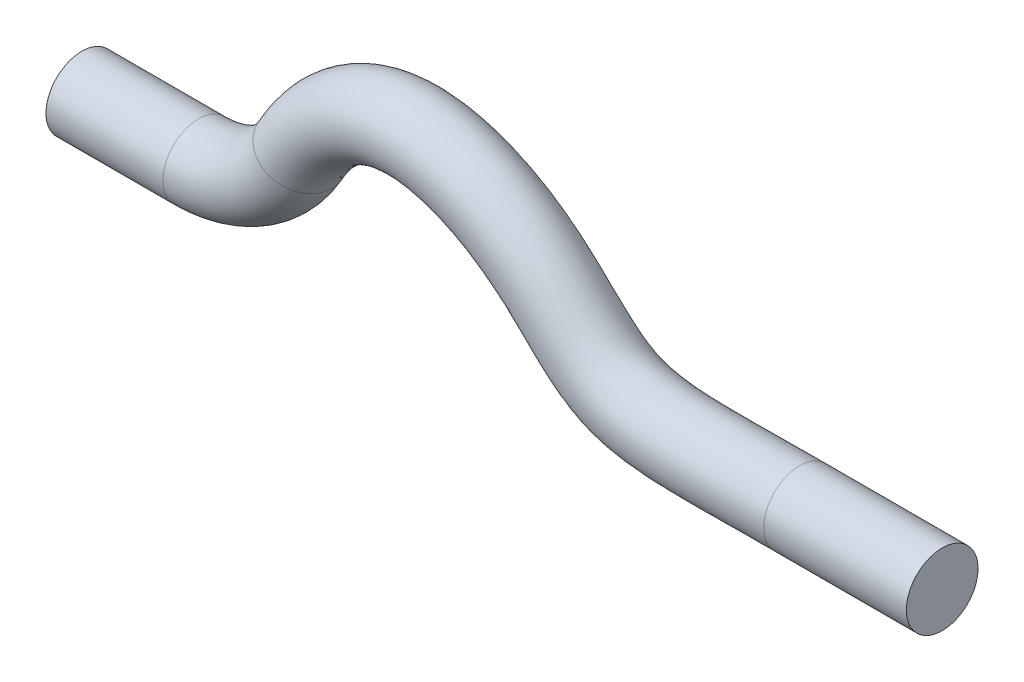
ISO-10303-21;
HEADER;
FILE_DESCRIPTION(('STEP AP214'),'2;1');
FILE_NAME('part.step','',(''),(''),'','','');
FILE_SCHEMA(('AUTOMOTIVE_DESIGN { 1 0 10303 214 1 1 1 1 }'));
ENDSEC;
DATA;
#1=APPLICATION_CONTEXT('core data for automotive mechanical design processes');
#2=APPLICATION_PROTOCOL_DEFINITION('international standard','automotive_design',2000,#1);
#3=PRODUCT_CONTEXT('',#1,'mechanical');
#4=PRODUCT('Part','Part','',(#3));
#5=PRODUCT_RELATED_PRODUCT_CATEGORY('part','',(#4));
#6=PRODUCT_DEFINITION_FORMATION('','',#4);
#7=PRODUCT_DEFINITION_CONTEXT('part definition',#1,'design');
#8=PRODUCT_DEFINITION('design','',#6,#7);
#9=PRODUCT_DEFINITION_SHAPE('','',#8);
#10=(LENGTH_UNIT() NAMED_UNIT(*) SI_UNIT(.MILLI.,.METRE.));
#11=(NAMED_UNIT(*) PLANE_ANGLE_UNIT() SI_UNIT($,.RADIAN.));
#12=(NAMED_UNIT(*) SI_UNIT($,.STERADIAN.) SOLID_ANGLE_UNIT());
#13=UNCERTAINTY_MEASURE_WITH_UNIT(LENGTH_MEASURE(1.E-05),#10,'distance_accuracy_value','');
#14=(GEOMETRIC_REPRESENTATION_CONTEXT(3) GLOBAL_UNCERTAINTY_ASSIGNED_CONTEXT((#13)) GLOBAL_UNIT_ASSIGNED_CONTEXT((#10,
#11,#12)) REPRESENTATION_CONTEXT('',''));
#15=CARTESIAN_POINT('',(0.,0.,0.));
#16=DIRECTION('',(0.,0.,1.));
#17=DIRECTION('',(1.,0.,0.));
#18=AXIS2_PLACEMENT_3D('',#15,#16,#17);
#19=CARTESIAN_POINT('',(-19.3689752133774,-5.27266948143954,0.));
#20=DIRECTION('',(-1.,0.,0.));
#21=DIRECTION('',(0.,0.,1.));
#22=AXIS2_PLACEMENT_3D('',#19,#20,#21);
#23=PLANE('',#22);
#24=CARTESIAN_POINT('',(-19.3689752133774,-5.27266948143954,0.));
#25=DIRECTION('',(-1.,0.,0.));
#26=DIRECTION('',(0.,0.,1.));
#27=AXIS2_PLACEMENT_3D('',#24,#25,#26);
#28=CIRCLE('',#27,3.175);
#29=CARTESIAN_POINT('',(-19.3689752133774,-5.27266948143954,3.175));
#30=VERTEX_POINT('',#29);
#31=EDGE_CURVE('E57',#30,#30,#28,.T.);
#32=ORIENTED_EDGE('',*,*,#31,.T.);
#33=EDGE_LOOP('',(#32));
#34=FACE_BOUND('',#33,.T.);
#35=ADVANCED_FACE('F45',(#34),#23,.T.);
#36=CARTESIAN_POINT('',(56.8310247866226,-5.27266948143953,0.));
#37=DIRECTION('',(-1.,0.,0.));
#38=DIRECTION('',(0.,0.,1.));
#39=AXIS2_PLACEMENT_3D('',#36,#37,#38);
#40=PLANE('',#39);
#41=CARTESIAN_POINT('',(56.8310247866226,-5.27266948143953,0.));
#42=DIRECTION('',(-1.,0.,0.));
#43=DIRECTION('',(0.,0.,1.));
#44=AXIS2_PLACEMENT_3D('',#41,#42,#43);
#45=CIRCLE('',#44,3.175);
#46=CARTESIAN_POINT('',(56.8310247866226,-5.27266948143953,3.175));
#47=VERTEX_POINT('',#46);
#48=EDGE_CURVE('E12',#47,#47,#45,.T.);
#49=ORIENTED_EDGE('',*,*,#48,.F.);
#50=EDGE_LOOP('',(#49));
#51=FACE_BOUND('',#50,.T.);
#52=ADVANCED_FACE('F63',(#51),#40,.F.);
#53=CARTESIAN_POINT('',(-19.3689752133774,-5.27266948143954,0.));
#54=DIRECTION('',(1.,0.,0.));
#55=DIRECTION('',(0.,1.,0.));
#56=AXIS2_PLACEMENT_3D('',#53,#54,#55);
#57=CYLINDRICAL_SURFACE('',#56,3.175);
#58=CARTESIAN_POINT('',(-9.01458874131206,-5.27266948143953,0.));
#59=DIRECTION('',(-1.,0.,0.));
#60=DIRECTION('',(0.,0.,1.));
#61=AXIS2_PLACEMENT_3D('',#58,#59,#60);
#62=CIRCLE('',#61,3.175);
#63=CARTESIAN_POINT('',(-9.01458874131206,-8.44766948143953,0.));
#64=VERTEX_POINT('',#63);
#65=EDGE_CURVE('E100',#64,#64,#62,.T.);
#66=ORIENTED_EDGE('',*,*,#65,.T.);
#67=EDGE_LOOP('',(#66));
#68=FACE_BOUND('',#67,.T.);
#69=ORIENTED_EDGE('',*,*,#31,.F.);
#70=EDGE_LOOP('',(#69));
#71=FACE_BOUND('',#70,.T.);
#72=ADVANCED_FACE('F65',(#68,#71),#57,.T.);
#73=CARTESIAN_POINT('',(-9.01458874131206,5.06970585797941,0.));
#74=DIRECTION('',(0.,0.,1.));
#75=DIRECTION('',(1.,0.,0.));
#76=AXIS2_PLACEMENT_3D('',#73,#74,#75);
#77=TOROIDAL_SURFACE('',#76,10.3423753394189,3.175);
#78=CARTESIAN_POINT('',(0.,0.,0.));
#79=DIRECTION('',(-0.490187765537451,-0.871616862226403,0.));
#80=DIRECTION('',(0.,0.,1.));
#81=AXIS2_PLACEMENT_3D('',#78,#79,#80);
#82=CIRCLE('',#81,3.175);
#83=CARTESIAN_POINT('',(2.76738353756884,-1.55634615558141,0.));
#84=VERTEX_POINT('',#83);
#85=EDGE_CURVE('E97',#84,#84,#82,.T.);
#86=CARTESIAN_POINT('',(-9.01458874131206,5.06970585797941,0.));
#87=DIRECTION('',(0.,0.,1.));
#88=DIRECTION('',(1.,0.,0.));
#89=AXIS2_PLACEMENT_3D('',#86,#87,#88);
#90=CIRCLE('',#89,13.5173753394189);
#91=EDGE_CURVE('',#64,#84,#90,.T.);
#92=ORIENTED_EDGE('',*,*,#65,.F.);
#93=ORIENTED_EDGE('',*,*,#85,.T.);
#94=ORIENTED_EDGE('',*,*,#91,.T.);
#95=ORIENTED_EDGE('',*,*,#91,.F.);
#96=EDGE_LOOP('',(#92,#94,#93,#95));
#97=FACE_BOUND('',#96,.T.);
#98=ADVANCED_FACE('F70',(#97),#77,.T.);
#99=CARTESIAN_POINT('',(0.,0.,3.175));
#100=CARTESIAN_POINT('',(0.0179445230622243,0.0319076688266583,3.175));
#101=CARTESIAN_POINT('',(0.0359517674536178,0.0637166488923755,3.175));
#102=CARTESIAN_POINT('',(0.072091765787753,0.12713615847851,3.175));
#103=CARTESIAN_POINT('',(0.0902245197372066,0.158746688067951,3.175));
#104=CARTESIAN_POINT('',(0.144811129629416,0.253278985201077,3.175));
#105=CARTESIAN_POINT('',(0.181453339510854,0.315901463266051,3.175));
#106=CARTESIAN_POINT('',(0.292133841114186,0.502558739506359,3.175));
#107=CARTESIAN_POINT('',(0.366926107618567,0.625383403790958,3.175));
#108=CARTESIAN_POINT('',(0.594318866395374,0.988911876281444,3.175));
#109=CARTESIAN_POINT('',(0.749937217849767,1.22467025798869,3.175));
#110=CARTESIAN_POINT('',(1.22879984669053,1.9113147931115,3.175));
#111=CARTESIAN_POINT('',(1.56408756425684,2.34155769594427,3.175));
#112=CARTESIAN_POINT('',(2.61640780855216,3.54310125661298,3.175));
#113=CARTESIAN_POINT('',(3.3801695267319,4.22438568329937,3.175));
#114=CARTESIAN_POINT('',(5.01210575200594,5.32379551918677,3.175));
#115=CARTESIAN_POINT('',(5.88069727925246,5.7424624582547,3.175));
#116=CARTESIAN_POINT('',(7.69722199795989,6.31477967837112,3.175));
#117=CARTESIAN_POINT('',(8.6442790863269,6.46822583806577,3.175));
#118=CARTESIAN_POINT('',(11.551155119051,6.55268026410206,3.175));
#119=CARTESIAN_POINT('',(13.5805566273362,6.10106409288495,3.175));
#120=CARTESIAN_POINT('',(17.4761377162625,4.47107818612049,3.175));
#121=CARTESIAN_POINT('',(19.3399306162714,3.29775940401148,3.175));
#122=CARTESIAN_POINT('',(22.2104097285695,0.940844427311304,3.175));
#123=CARTESIAN_POINT('',(23.3108676305977,-0.177364340917848,3.175));
#124=CARTESIAN_POINT('',(25.4278610911433,-2.20100764830497,3.175));
#125=CARTESIAN_POINT('',(26.4422867595301,-3.10160099137329,3.175));
#126=CARTESIAN_POINT('',(28.4601304132063,-4.29412077167498,3.175));
#127=CARTESIAN_POINT('',(29.4476707496934,-4.64717606066604,3.175));
#128=CARTESIAN_POINT('',(31.661669482953,-5.10730606176102,3.175));
#129=CARTESIAN_POINT('',(32.8922573499189,-5.21460755591082,3.175));
#130=CARTESIAN_POINT('',(35.6443508593447,-5.31732436691255,3.175));
#131=CARTESIAN_POINT('',(37.1751180443506,-5.31362559284405,3.175));
#132=CARTESIAN_POINT('',(40.5167916986024,-5.29120668977853,3.175));
#133=CARTESIAN_POINT('',(42.3191259285795,-5.27266948143953,3.175));
#134=CARTESIAN_POINT('',(44.2042236338849,-5.27266948143953,3.175));
#135=CARTESIAN_POINT('',(-5.53476707513766,3.11269231116282,3.175));
#136=CARTESIAN_POINT('',(-5.51941073764923,3.13999785332029,3.175));
#137=CARTESIAN_POINT('',(-5.48707772700504,3.19721146212178,3.175));
#138=CARTESIAN_POINT('',(-5.43903282435021,3.28152204047384,3.175));
#139=CARTESIAN_POINT('',(-5.41489155986071,3.32360751820176,3.175));
#140=CARTESIAN_POINT('',(-5.34210867936014,3.44965185199946,3.175));
#141=CARTESIAN_POINT('',(-5.2931079722592,3.53339863643042,3.175));
#142=CARTESIAN_POINT('',(-5.14464844856222,3.78376839345605,3.175));
#143=CARTESIAN_POINT('',(-5.04373211260848,3.94952123462761,3.175));
#144=CARTESIAN_POINT('',(-4.73498812428209,4.44310436777664,3.175));
#145=CARTESIAN_POINT('',(-4.52116186907518,4.76726740982039,3.175));
#146=CARTESIAN_POINT('',(-3.85446725971239,5.72324555873189,3.175));
#147=CARTESIAN_POINT('',(-3.37625468414411,6.33868416737513,3.175));
#148=CARTESIAN_POINT('',(-1.8337610082356,8.09990975509461,3.175));
#149=CARTESIAN_POINT('',(-0.657649885299599,9.16072864531053,3.175));
#150=CARTESIAN_POINT('',(1.95414302571037,10.9202525574319,3.175));
#151=CARTESIAN_POINT('',(3.38939316976886,11.6152553794002,3.175));
#152=CARTESIAN_POINT('',(6.37217561014501,12.555015646887,3.175));
#153=CARTESIAN_POINT('',(7.91318899995941,12.7996646753187,3.175));
#154=CARTESIAN_POINT('',(12.4601028225135,12.9317676624278,3.175));
#155=CARTESIAN_POINT('',(15.3662892735911,12.237333821297,3.175));
#156=CARTESIAN_POINT('',(20.5925099438413,10.0505827729612,3.175));
#157=CARTESIAN_POINT('',(22.9404228145701,8.55772367011996,3.175));
#158=CARTESIAN_POINT('',(26.5757874589888,5.57277062386384,3.175));
#159=CARTESIAN_POINT('',(27.7949179042231,4.3208051068894,3.175));
#160=CARTESIAN_POINT('',(29.7193782747691,2.48120502029407,3.175));
#161=CARTESIAN_POINT('',(30.4186379096811,1.92445329518196,3.175));
#162=CARTESIAN_POINT('',(31.0338059683189,1.56089683168912,3.175));
#163=CARTESIAN_POINT('',(31.2722622153288,1.45930940973604,3.175));
#164=CARTESIAN_POINT('',(32.4212696357557,1.22051398439849,3.175));
#165=CARTESIAN_POINT('',(33.3204463652934,1.12383237131467,3.175));
#166=CARTESIAN_POINT('',(35.6898360909597,1.03539927378349,3.175));
#167=CARTESIAN_POINT('',(37.1535890906613,1.0363728742651,3.175));
#168=CARTESIAN_POINT('',(40.453119730972,1.0585090447393,3.175));
#169=CARTESIAN_POINT('',(42.3002978516107,1.07733051856047,3.175));
#170=CARTESIAN_POINT('',(44.2042236338849,1.07733051856047,3.175));
#171=CARTESIAN_POINT('',(-5.53476707513766,3.11269231116282,-3.175));
#172=CARTESIAN_POINT('',(-5.51941073764923,3.13999785332029,-3.175));
#173=CARTESIAN_POINT('',(-5.48707772700504,3.19721146212178,-3.175));
#174=CARTESIAN_POINT('',(-5.43903282435021,3.28152204047384,-3.175));
#175=CARTESIAN_POINT('',(-5.41489155986071,3.32360751820176,-3.175));
#176=CARTESIAN_POINT('',(-5.34210867936014,3.44965185199946,-3.175));
#177=CARTESIAN_POINT('',(-5.2931079722592,3.53339863643042,-3.175));
#178=CARTESIAN_POINT('',(-5.14464844856222,3.78376839345605,-3.175));
#179=CARTESIAN_POINT('',(-5.04373211260848,3.94952123462761,-3.175));
#180=CARTESIAN_POINT('',(-4.73498812428209,4.44310436777664,-3.175));
#181=CARTESIAN_POINT('',(-4.52116186907518,4.76726740982039,-3.175));
#182=CARTESIAN_POINT('',(-3.85446725971239,5.72324555873189,-3.175));
#183=CARTESIAN_POINT('',(-3.37625468414411,6.33868416737513,-3.175));
#184=CARTESIAN_POINT('',(-1.8337610082356,8.09990975509461,-3.175));
#185=CARTESIAN_POINT('',(-0.657649885299599,9.16072864531053,-3.175));
#186=CARTESIAN_POINT('',(1.95414302571037,10.9202525574319,-3.175));
#187=CARTESIAN_POINT('',(3.38939316976886,11.6152553794002,-3.175));
#188=CARTESIAN_POINT('',(6.37217561014501,12.555015646887,-3.175));
#189=CARTESIAN_POINT('',(7.91318899995941,12.7996646753187,-3.175));
#190=CARTESIAN_POINT('',(12.4601028225135,12.9317676624278,-3.175));
#191=CARTESIAN_POINT('',(15.3662892735911,12.237333821297,-3.175));
#192=CARTESIAN_POINT('',(20.5925099438413,10.0505827729612,-3.175));
#193=CARTESIAN_POINT('',(22.9404228145701,8.55772367011996,-3.175));
#194=CARTESIAN_POINT('',(26.5757874589888,5.57277062386384,-3.175));
#195=CARTESIAN_POINT('',(27.7949179042231,4.3208051068894,-3.175));
#196=CARTESIAN_POINT('',(29.7193782747691,2.48120502029407,-3.175));
#197=CARTESIAN_POINT('',(30.4186379096811,1.92445329518196,-3.175));
#198=CARTESIAN_POINT('',(31.0338059683189,1.56089683168912,-3.175));
#199=CARTESIAN_POINT('',(31.2722622153288,1.45930940973604,-3.175));
#200=CARTESIAN_POINT('',(32.4212696357557,1.22051398439849,-3.175));
#201=CARTESIAN_POINT('',(33.3204463652934,1.12383237131467,-3.175));
#202=CARTESIAN_POINT('',(35.6898360909597,1.03539927378349,-3.175));
#203=CARTESIAN_POINT('',(37.1535890906613,1.0363728742651,-3.175));
#204=CARTESIAN_POINT('',(40.453119730972,1.0585090447393,-3.175));
#205=CARTESIAN_POINT('',(42.3002978516107,1.07733051856047,-3.175));
#206=CARTESIAN_POINT('',(44.2042236338849,1.07733051856047,-3.175));
#207=CARTESIAN_POINT('',(0.,0.,-3.175));
#208=CARTESIAN_POINT('',(0.0179445230622243,0.0319076688266583,-3.175));
#209=CARTESIAN_POINT('',(0.0359517674536178,0.0637166488923755,-3.175));
#210=CARTESIAN_POINT('',(0.072091765787753,0.12713615847851,-3.175));
#211=CARTESIAN_POINT('',(0.0902245197372066,0.158746688067951,-3.175));
#212=CARTESIAN_POINT('',(0.144811129629416,0.253278985201077,-3.175));
#213=CARTESIAN_POINT('',(0.181453339510854,0.315901463266051,-3.175));
#214=CARTESIAN_POINT('',(0.292133841114186,0.502558739506359,-3.175));
#215=CARTESIAN_POINT('',(0.366926107618567,0.625383403790958,-3.175));
#216=CARTESIAN_POINT('',(0.594318866395374,0.988911876281444,-3.175));
#217=CARTESIAN_POINT('',(0.749937217849767,1.22467025798869,-3.175));
#218=CARTESIAN_POINT('',(1.22879984669053,1.9113147931115,-3.175));
#219=CARTESIAN_POINT('',(1.56408756425684,2.34155769594427,-3.175));
#220=CARTESIAN_POINT('',(2.61640780855216,3.54310125661298,-3.175));
#221=CARTESIAN_POINT('',(3.3801695267319,4.22438568329937,-3.175));
#222=CARTESIAN_POINT('',(5.01210575200594,5.32379551918677,-3.175));
#223=CARTESIAN_POINT('',(5.88069727925246,5.7424624582547,-3.175));
#224=CARTESIAN_POINT('',(7.69722199795989,6.31477967837112,-3.175));
#225=CARTESIAN_POINT('',(8.6442790863269,6.46822583806577,-3.175));
#226=CARTESIAN_POINT('',(11.551155119051,6.55268026410206,-3.175));
#227=CARTESIAN_POINT('',(13.5805566273362,6.10106409288495,-3.175));
#228=CARTESIAN_POINT('',(17.4761377162625,4.47107818612049,-3.175));
#229=CARTESIAN_POINT('',(19.3399306162714,3.29775940401148,-3.175));
#230=CARTESIAN_POINT('',(22.2104097285695,0.940844427311304,-3.175));
#231=CARTESIAN_POINT('',(23.3108676305977,-0.177364340917848,-3.175));
#232=CARTESIAN_POINT('',(25.4278610911433,-2.20100764830497,-3.175));
#233=CARTESIAN_POINT('',(26.4422867595301,-3.10160099137329,-3.175));
#234=CARTESIAN_POINT('',(28.4601304132063,-4.29412077167498,-3.175));
#235=CARTESIAN_POINT('',(29.4476707496934,-4.64717606066604,-3.175));
#236=CARTESIAN_POINT('',(31.661669482953,-5.10730606176102,-3.175));
#237=CARTESIAN_POINT('',(32.8922573499189,-5.21460755591082,-3.175));
#238=CARTESIAN_POINT('',(35.6443508593447,-5.31732436691255,-3.175));
#239=CARTESIAN_POINT('',(37.1751180443506,-5.31362559284405,-3.175));
#240=CARTESIAN_POINT('',(40.5167916986024,-5.29120668977853,-3.175));
#241=CARTESIAN_POINT('',(42.3191259285795,-5.27266948143953,-3.175));
#242=CARTESIAN_POINT('',(44.2042236338849,-5.27266948143953,-3.175));
#243=CARTESIAN_POINT('',(5.53476707513766,-3.11269231116281,-3.175));
#244=CARTESIAN_POINT('',(5.55529978377368,-3.07618251566698,-3.175));
#245=CARTESIAN_POINT('',(5.55898126191227,-3.06977816433703,-3.175));
#246=CARTESIAN_POINT('',(5.58321635592571,-3.02724972351682,-3.175));
#247=CARTESIAN_POINT('',(5.59534059933513,-3.00611414206586,-3.175));
#248=CARTESIAN_POINT('',(5.63173093861897,-2.9430938815973,-3.175));
#249=CARTESIAN_POINT('',(5.65601465128092,-2.90159570989832,-3.175));
#250=CARTESIAN_POINT('',(5.7289161307906,-2.77865091444333,-3.175));
#251=CARTESIAN_POINT('',(5.77758432784562,-2.69875442704569,-3.175));
#252=CARTESIAN_POINT('',(5.92362585707284,-2.46528061521375,-3.175));
#253=CARTESIAN_POINT('',(6.02103630477471,-2.31792689384302,-3.175));
#254=CARTESIAN_POINT('',(6.31206695309345,-1.9006159725089,-3.175));
#255=CARTESIAN_POINT('',(6.50442981265779,-1.65556877548658,-3.175));
#256=CARTESIAN_POINT('',(7.06657662533993,-1.01370724186865,-3.175));
#257=CARTESIAN_POINT('',(7.41798893876341,-0.711957278711783,-3.175));
#258=CARTESIAN_POINT('',(8.0700684783015,-0.272661519058345,-3.175));
#259=CARTESIAN_POINT('',(8.37200138873606,-0.130330462890742,-3.175));
#260=CARTESIAN_POINT('',(9.02226838577476,0.074543709855259,-3.175));
#261=CARTESIAN_POINT('',(9.37536917269438,0.1367870008128,-3.175));
#262=CARTESIAN_POINT('',(10.6422074155884,0.173592865776286,-3.175));
#263=CARTESIAN_POINT('',(11.7948239810814,-0.0352056355270868,-3.175));
#264=CARTESIAN_POINT('',(14.3597654886837,-1.10842640072023,-3.175));
#265=CARTESIAN_POINT('',(15.7394384179726,-1.96220486209701,-3.175));
#266=CARTESIAN_POINT('',(17.8450319981501,-3.69108176924123,-3.175));
#267=CARTESIAN_POINT('',(18.8268173569723,-4.67553378872509,-3.175));
#268=CARTESIAN_POINT('',(21.1363439075174,-6.883220316904,-3.175));
#269=CARTESIAN_POINT('',(22.4659356093791,-8.12765527792853,-3.175));
#270=CARTESIAN_POINT('',(25.8864548580936,-10.1491383750391,-3.175));
#271=CARTESIAN_POINT('',(27.623079284058,-10.7536615310681,-3.175));
#272=CARTESIAN_POINT('',(30.9020693301504,-11.4351261079205,-3.175));
#273=CARTESIAN_POINT('',(32.4640683345445,-11.5530474831363,-3.175));
#274=CARTESIAN_POINT('',(35.5988656277296,-11.6700480076086,-3.175));
#275=CARTESIAN_POINT('',(37.1966469980399,-11.6636240599532,-3.175));
#276=CARTESIAN_POINT('',(40.5804636662327,-11.6409224242964,-3.175));
#277=CARTESIAN_POINT('',(42.3379540055484,-11.6226694814395,-3.175));
#278=CARTESIAN_POINT('',(44.2042236338849,-11.6226694814395,-3.175));
#279=CARTESIAN_POINT('',(5.53476707513766,-3.11269231116281,3.175));
#280=CARTESIAN_POINT('',(5.55529978377368,-3.07618251566698,3.175));
#281=CARTESIAN_POINT('',(5.55898126191227,-3.06977816433703,3.175));
#282=CARTESIAN_POINT('',(5.58321635592571,-3.02724972351682,3.175));
#283=CARTESIAN_POINT('',(5.59534059933513,-3.00611414206586,3.175));
#284=CARTESIAN_POINT('',(5.63173093861897,-2.9430938815973,3.175));
#285=CARTESIAN_POINT('',(5.65601465128092,-2.90159570989832,3.175));
#286=CARTESIAN_POINT('',(5.7289161307906,-2.77865091444333,3.175));
#287=CARTESIAN_POINT('',(5.77758432784562,-2.69875442704569,3.175));
#288=CARTESIAN_POINT('',(5.92362585707284,-2.46528061521375,3.175));
#289=CARTESIAN_POINT('',(6.02103630477471,-2.31792689384302,3.175));
#290=CARTESIAN_POINT('',(6.31206695309345,-1.9006159725089,3.175));
#291=CARTESIAN_POINT('',(6.50442981265779,-1.65556877548658,3.175));
#292=CARTESIAN_POINT('',(7.06657662533993,-1.01370724186865,3.175));
#293=CARTESIAN_POINT('',(7.41798893876341,-0.711957278711783,3.175));
#294=CARTESIAN_POINT('',(8.0700684783015,-0.272661519058345,3.175));
#295=CARTESIAN_POINT('',(8.37200138873606,-0.130330462890742,3.175));
#296=CARTESIAN_POINT('',(9.02226838577476,0.0745437098552591,3.175));
#297=CARTESIAN_POINT('',(9.37536917269438,0.1367870008128,3.175));
#298=CARTESIAN_POINT('',(10.6422074155884,0.173592865776286,3.175));
#299=CARTESIAN_POINT('',(11.7948239810814,-0.0352056355270868,3.175));
#300=CARTESIAN_POINT('',(14.3597654886837,-1.10842640072023,3.175));
#301=CARTESIAN_POINT('',(15.7394384179726,-1.96220486209701,3.175));
#302=CARTESIAN_POINT('',(17.8450319981501,-3.69108176924123,3.175));
#303=CARTESIAN_POINT('',(18.8268173569723,-4.67553378872509,3.175));
#304=CARTESIAN_POINT('',(21.1363439075174,-6.883220316904,3.175));
#305=CARTESIAN_POINT('',(22.4659356093791,-8.12765527792853,3.175));
#306=CARTESIAN_POINT('',(25.8864548580936,-10.1491383750391,3.175));
#307=CARTESIAN_POINT('',(27.623079284058,-10.7536615310681,3.175));
#308=CARTESIAN_POINT('',(30.9020693301504,-11.4351261079205,3.175));
#309=CARTESIAN_POINT('',(32.4640683345445,-11.5530474831363,3.175));
#310=CARTESIAN_POINT('',(35.5988656277296,-11.6700480076086,3.175));
#311=CARTESIAN_POINT('',(37.1966469980399,-11.6636240599532,3.175));
#312=CARTESIAN_POINT('',(40.5804636662327,-11.6409224242964,3.175));
#313=CARTESIAN_POINT('',(42.3379540055484,-11.6226694814395,3.175));
#314=CARTESIAN_POINT('',(44.2042236338849,-11.6226694814395,3.175));
#315=CARTESIAN_POINT('',(0.,0.,3.175));
#316=CARTESIAN_POINT('',(0.0179445230622243,0.0319076688266583,3.175));
#317=CARTESIAN_POINT('',(0.0359517674536178,0.0637166488923755,3.175));
#318=CARTESIAN_POINT('',(0.072091765787753,0.12713615847851,3.175));
#319=CARTESIAN_POINT('',(0.0902245197372066,0.158746688067951,3.175));
#320=CARTESIAN_POINT('',(0.144811129629416,0.253278985201077,3.175));
#321=CARTESIAN_POINT('',(0.181453339510854,0.315901463266051,3.175));
#322=CARTESIAN_POINT('',(0.292133841114186,0.502558739506359,3.175));
#323=CARTESIAN_POINT('',(0.366926107618567,0.625383403790958,3.175));
#324=CARTESIAN_POINT('',(0.594318866395374,0.988911876281444,3.175));
#325=CARTESIAN_POINT('',(0.749937217849767,1.22467025798869,3.175));
#326=CARTESIAN_POINT('',(1.22879984669053,1.9113147931115,3.175));
#327=CARTESIAN_POINT('',(1.56408756425684,2.34155769594427,3.175));
#328=CARTESIAN_POINT('',(2.61640780855216,3.54310125661298,3.175));
#329=CARTESIAN_POINT('',(3.3801695267319,4.22438568329937,3.175));
#330=CARTESIAN_POINT('',(5.01210575200594,5.32379551918677,3.175));
#331=CARTESIAN_POINT('',(5.88069727925246,5.7424624582547,3.175));
#332=CARTESIAN_POINT('',(7.69722199795989,6.31477967837112,3.175));
#333=CARTESIAN_POINT('',(8.6442790863269,6.46822583806577,3.175));
#334=CARTESIAN_POINT('',(11.551155119051,6.55268026410206,3.175));
#335=CARTESIAN_POINT('',(13.5805566273362,6.10106409288495,3.175));
#336=CARTESIAN_POINT('',(17.4761377162625,4.47107818612049,3.175));
#337=CARTESIAN_POINT('',(19.3399306162714,3.29775940401148,3.175));
#338=CARTESIAN_POINT('',(22.2104097285695,0.940844427311304,3.175));
#339=CARTESIAN_POINT('',(23.3108676305977,-0.177364340917848,3.175));
#340=CARTESIAN_POINT('',(25.4278610911433,-2.20100764830497,3.175));
#341=CARTESIAN_POINT('',(26.4422867595301,-3.10160099137329,3.175));
#342=CARTESIAN_POINT('',(28.4601304132063,-4.29412077167498,3.175));
#343=CARTESIAN_POINT('',(29.4476707496934,-4.64717606066604,3.175));
#344=CARTESIAN_POINT('',(31.661669482953,-5.10730606176102,3.175));
#345=CARTESIAN_POINT('',(32.8922573499189,-5.21460755591082,3.175));
#346=CARTESIAN_POINT('',(35.6443508593447,-5.31732436691255,3.175));
#347=CARTESIAN_POINT('',(37.1751180443506,-5.31362559284405,3.175));
#348=CARTESIAN_POINT('',(40.5167916986024,-5.29120668977853,3.175));
#349=CARTESIAN_POINT('',(42.3191259285795,-5.27266948143953,3.175));
#350=CARTESIAN_POINT('',(44.2042236338849,-5.27266948143953,3.175));
#351=(BOUNDED_SURFACE() B_SPLINE_SURFACE(3,3,((#99,#100,#101,#102,#103,#104,#105,#106,#107,#108,
#109,#110,#111,#112,#113,#114,#115,#116,#117,#118,#119,#120,#121,#122,#123,#124,#125,#126,#127,
#128,#129,#130,#131,#132,#133,#134),(#135,#136,#137,#138,#139,#140,#141,#142,#143,#144,#145,
#146,#147,#148,#149,#150,#151,#152,#153,#154,#155,#156,#157,#158,#159,#160,#161,#162,#163,#164,
#165,#166,#167,#168,#169,#170),(#171,#172,#173,#174,#175,#176,#177,#178,#179,#180,#181,#182,
#183,#184,#185,#186,#187,#188,#189,#190,#191,#192,#193,#194,#195,#196,#197,#198,#199,#200,#201,
#202,#203,#204,#205,#206),(#207,#208,#209,#210,#211,#212,#213,#214,#215,#216,#217,#218,#219,
#220,#221,#222,#223,#224,#225,#226,#227,#228,#229,#230,#231,#232,#233,#234,#235,#236,#237,#238,
#239,#240,#241,#242),(#243,#244,#245,#246,#247,#248,#249,#250,#251,#252,#253,#254,#255,#256,
#257,#258,#259,#260,#261,#262,#263,#264,#265,#266,#267,#268,#269,#270,#271,#272,#273,#274,#275,
#276,#277,#278),(#279,#280,#281,#282,#283,#284,#285,#286,#287,#288,#289,#290,#291,#292,#293,
#294,#295,#296,#297,#298,#299,#300,#301,#302,#303,#304,#305,#306,#307,#308,#309,#310,#311,#312,
#313,#314),(#315,#316,#317,#318,#319,#320,#321,#322,#323,#324,#325,#326,#327,#328,#329,#330,
#331,#332,#333,#334,#335,#336,#337,#338,#339,#340,#341,#342,#343,#344,#345,#346,#347,#348,#349,
#350)),.UNSPECIFIED.,.T.,.F.,.F.) B_SPLINE_SURFACE_WITH_KNOTS((4,3,4),(4,2,2,2,2,2,2,2,2,2,2,2,
2,2,2,2,2,4),(0.,0.5,1.),(0.25292754354048,0.254048519295472,0.255169495050464,
0.257411446560448,0.261895349580417,0.270863155620353,0.288798767700225,0.32466999185997,
0.360541216019715,0.39641244017946,0.468154888498949,0.539897336818439,0.596037431729515,
0.652177526640591,0.70165179502361,0.751126063406629,0.800600331789648,0.850074600172667),
.UNSPECIFIED.) GEOMETRIC_REPRESENTATION_ITEM() RATIONAL_B_SPLINE_SURFACE(((1.,1.,1.,1.,1.,1.,1.,
1.,1.,1.,1.,1.,1.,1.,1.,1.,1.,1.,1.,1.,1.,1.,1.,1.,1.,1.,1.,1.,1.,1.,1.,1.,1.,1.,1.,1.),
(0.333333333333333,0.333333333333333,0.333333333333333,0.333333333333333,0.333333333333333,
0.333333333333333,0.333333333333333,0.333333333333333,0.333333333333333,0.333333333333333,
0.333333333333333,0.333333333333333,0.333333333333333,0.333333333333333,0.333333333333333,
0.333333333333333,0.333333333333333,0.333333333333333,0.333333333333333,0.333333333333333,
0.333333333333333,0.333333333333333,0.333333333333333,0.333333333333333,0.333333333333333,
0.333333333333333,0.333333333333333,0.333333333333333,0.333333333333333,0.333333333333333,
0.333333333333333,0.333333333333333,0.333333333333333,0.333333333333333,0.333333333333333,
0.333333333333333),(0.333333333333333,0.333333333333333,0.333333333333333,0.333333333333333,
0.333333333333333,0.333333333333333,0.333333333333333,0.333333333333333,0.333333333333333,
0.333333333333333,0.333333333333333,0.333333333333333,0.333333333333333,0.333333333333333,
0.333333333333333,0.333333333333333,0.333333333333333,0.333333333333333,0.333333333333333,
0.333333333333333,0.333333333333333,0.333333333333333,0.333333333333333,0.333333333333333,
0.333333333333333,0.333333333333333,0.333333333333333,0.333333333333333,0.333333333333333,
0.333333333333333,0.333333333333333,0.333333333333333,0.333333333333333,0.333333333333333,
0.333333333333333,0.333333333333333),(1.,1.,1.,1.,1.,1.,1.,1.,1.,1.,1.,1.,1.,1.,1.,1.,1.,1.,1.,
1.,1.,1.,1.,1.,1.,1.,1.,1.,1.,1.,1.,1.,1.,1.,1.,1.),(0.333333333333333,0.333333333333333,
0.333333333333333,0.333333333333333,0.333333333333333,0.333333333333333,0.333333333333333,
0.333333333333333,0.333333333333333,0.333333333333333,0.333333333333333,0.333333333333333,
0.333333333333333,0.333333333333333,0.333333333333333,0.333333333333333,0.333333333333333,
0.333333333333333,0.333333333333333,0.333333333333333,0.333333333333333,0.333333333333333,
0.333333333333333,0.333333333333333,0.333333333333333,0.333333333333333,0.333333333333333,
0.333333333333333,0.333333333333333,0.333333333333333,0.333333333333333,0.333333333333333,
0.333333333333333,0.333333333333333,0.333333333333333,0.333333333333333),(0.333333333333333,
0.333333333333333,0.333333333333333,0.333333333333333,0.333333333333333,0.333333333333333,
0.333333333333333,0.333333333333333,0.333333333333333,0.333333333333333,0.333333333333333,
0.333333333333333,0.333333333333333,0.333333333333333,0.333333333333333,0.333333333333333,
0.333333333333333,0.333333333333333,0.333333333333333,0.333333333333333,0.333333333333333,
0.333333333333333,0.333333333333333,0.333333333333333,0.333333333333333,0.333333333333333,
0.333333333333333,0.333333333333333,0.333333333333333,0.333333333333333,0.333333333333333,
0.333333333333333,0.333333333333333,0.333333333333333,0.333333333333333,0.333333333333333),(1.,
1.,1.,1.,1.,1.,1.,1.,1.,1.,1.,1.,1.,1.,1.,1.,1.,1.,1.,1.,1.,1.,1.,1.,1.,1.,1.,1.,1.,1.,1.,1.,1.,
1.,1.,1.))) REPRESENTATION_ITEM('') SURFACE());
#352=CARTESIAN_POINT('',(44.2042236338849,-5.27266948143953,0.));
#353=DIRECTION('',(-1.,0.,0.));
#354=DIRECTION('',(0.,0.,1.));
#355=AXIS2_PLACEMENT_3D('',#352,#353,#354);
#356=CIRCLE('',#355,3.175);
#357=CARTESIAN_POINT('',(44.2042236338849,-5.27266948143953,3.175));
#358=VERTEX_POINT('',#357);
#359=EDGE_CURVE('E52',#358,#358,#356,.T.);
#360=ORIENTED_EDGE('',*,*,#359,.T.);
#361=EDGE_LOOP('',(#360));
#362=FACE_BOUND('',#361,.T.);
#363=ORIENTED_EDGE('',*,*,#85,.F.);
#364=EDGE_LOOP('',(#363));
#365=FACE_BOUND('',#364,.T.);
#366=ADVANCED_FACE('F76',(#362,#365),#351,.F.);
#367=CARTESIAN_POINT('',(44.2042236338849,-5.27266948143953,0.));
#368=DIRECTION('',(1.,0.,0.));
#369=DIRECTION('',(0.,0.,-1.));
#370=AXIS2_PLACEMENT_3D('',#367,#368,#369);
#371=CYLINDRICAL_SURFACE('',#370,3.175);
#372=ORIENTED_EDGE('',*,*,#48,.T.);
#373=EDGE_LOOP('',(#372));
#374=FACE_BOUND('',#373,.T.);
#375=ORIENTED_EDGE('',*,*,#359,.F.);
#376=EDGE_LOOP('',(#375));
#377=FACE_BOUND('',#376,.T.);
#378=ADVANCED_FACE('F60',(#374,#377),#371,.T.);
#379=CLOSED_SHELL('',(#35,#52,#72,#98,#366,#378));
#380=MANIFOLD_SOLID_BREP('B2',#379);
#381=ADVANCED_BREP_SHAPE_REPRESENTATION('',(#18,#380),#14);
#382=SHAPE_DEFINITION_REPRESENTATION(#9,#381);
ENDSEC;
END-ISO-10303-21;
